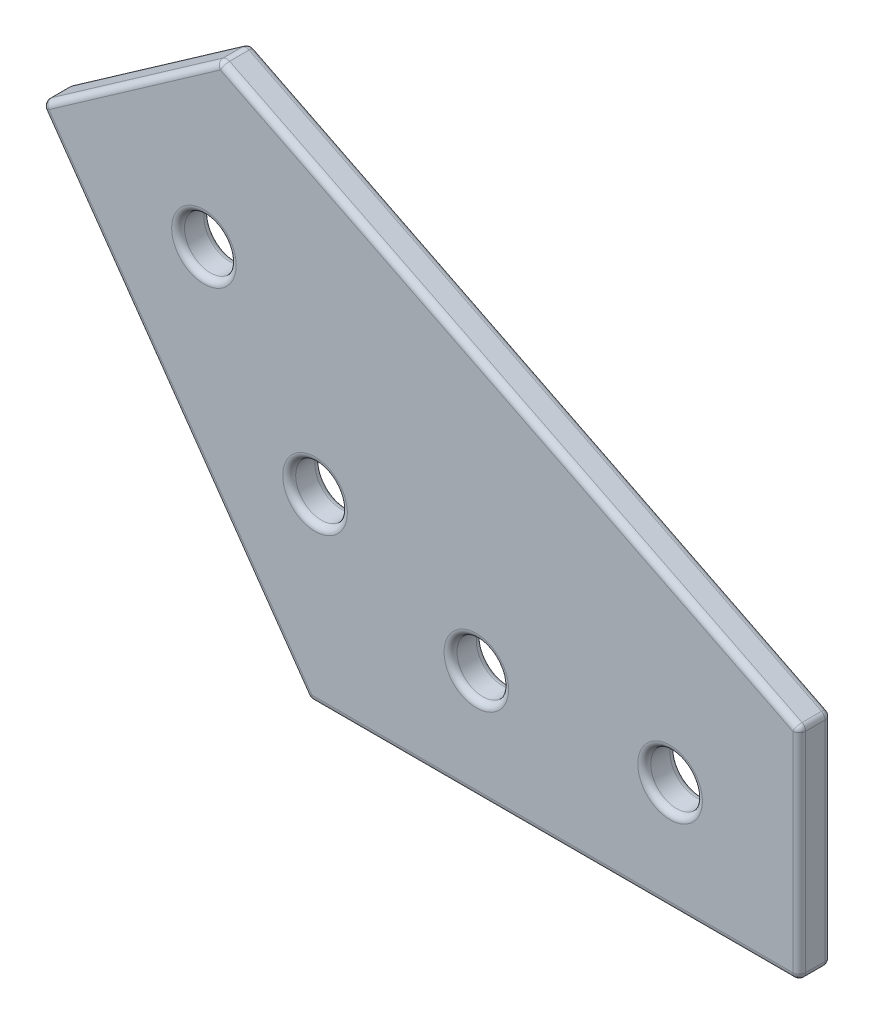
ISO-10303-21;
HEADER;
FILE_DESCRIPTION(('STEP AP214'),'2;1');
FILE_NAME('part.step','',(''),(''),'','','');
FILE_SCHEMA(('AUTOMOTIVE_DESIGN { 1 0 10303 214 1 1 1 1 }'));
ENDSEC;
DATA;
#1=APPLICATION_CONTEXT('core data for automotive mechanical design processes');
#2=APPLICATION_PROTOCOL_DEFINITION('international standard','automotive_design',2000,#1);
#3=PRODUCT_CONTEXT('',#1,'mechanical');
#4=PRODUCT('Part','Part','',(#3));
#5=PRODUCT_RELATED_PRODUCT_CATEGORY('part','',(#4));
#6=PRODUCT_DEFINITION_FORMATION('','',#4);
#7=PRODUCT_DEFINITION_CONTEXT('part definition',#1,'design');
#8=PRODUCT_DEFINITION('design','',#6,#7);
#9=PRODUCT_DEFINITION_SHAPE('','',#8);
#10=(LENGTH_UNIT() NAMED_UNIT(*) SI_UNIT(.MILLI.,.METRE.));
#11=(NAMED_UNIT(*) PLANE_ANGLE_UNIT() SI_UNIT($,.RADIAN.));
#12=(NAMED_UNIT(*) SI_UNIT($,.STERADIAN.) SOLID_ANGLE_UNIT());
#13=UNCERTAINTY_MEASURE_WITH_UNIT(LENGTH_MEASURE(1.E-05),#10,'distance_accuracy_value','');
#14=(GEOMETRIC_REPRESENTATION_CONTEXT(3) GLOBAL_UNCERTAINTY_ASSIGNED_CONTEXT((#13)) GLOBAL_UNIT_ASSIGNED_CONTEXT((#10,
#11,#12)) REPRESENTATION_CONTEXT('',''));
#15=CARTESIAN_POINT('',(0.,0.,0.));
#16=DIRECTION('',(0.,0.,1.));
#17=DIRECTION('',(1.,0.,0.));
#18=AXIS2_PLACEMENT_3D('',#15,#16,#17);
#19=CARTESIAN_POINT('',(-24.8760281440643,-35.,5.));
#20=DIRECTION('',(0.819152044288993,0.573576436351045,0.));
#21=DIRECTION('',(-0.573576436351045,0.819152044288992,0.));
#22=AXIS2_PLACEMENT_3D('',#19,#20,#21);
#23=PLANE('',#22);
#24=DIRECTION('',(0.573576436351045,-0.819152044288992,0.));
#25=VECTOR('',#24,1.);
#26=CARTESIAN_POINT('',(-24.8760281440643,-35.,1.));
#27=LINE('',#26,#25);
#28=CARTESIAN_POINT('',(-65.886743343164,23.569371166663,1.));
#29=VERTEX_POINT('',#28);
#30=CARTESIAN_POINT('',(-25.1746131378016,-34.573576436351,1.));
#31=VERTEX_POINT('',#30);
#32=EDGE_CURVE('E245',#29,#31,#27,.T.);
#33=ORIENTED_EDGE('',*,*,#32,.T.);
#34=DIRECTION('',(0.,0.,-1.));
#35=VECTOR('',#34,1.);
#36=CARTESIAN_POINT('',(-25.1746131378016,-34.573576436351,5.));
#37=LINE('',#36,#35);
#38=CARTESIAN_POINT('',(-25.1746131378016,-34.573576436351,4.));
#39=VERTEX_POINT('',#38);
#40=EDGE_CURVE('E252',#31,#39,#37,.F.);
#41=ORIENTED_EDGE('',*,*,#40,.T.);
#42=DIRECTION('',(0.573576436351045,-0.819152044288992,0.));
#43=VECTOR('',#42,1.);
#44=CARTESIAN_POINT('',(-24.8760281440643,-35.,4.));
#45=LINE('',#44,#43);
#46=CARTESIAN_POINT('',(-65.886743343164,23.569371166663,4.));
#47=VERTEX_POINT('',#46);
#48=EDGE_CURVE('E248',#39,#47,#45,.F.);
#49=ORIENTED_EDGE('',*,*,#48,.T.);
#50=DIRECTION('',(0.,0.,-1.));
#51=VECTOR('',#50,1.);
#52=CARTESIAN_POINT('',(-65.886743343164,23.569371166663,5.));
#53=LINE('',#52,#51);
#54=EDGE_CURVE('E242',#47,#29,#53,.T.);
#55=ORIENTED_EDGE('',*,*,#54,.T.);
#56=EDGE_LOOP('',(#33,#41,#49,#55));
#57=FACE_BOUND('',#56,.T.);
#58=ADVANCED_FACE('F38',(#57),#23,.F.);
#59=CARTESIAN_POINT('',(51.1239718559357,-35.,5.));
#60=DIRECTION('',(0.,1.,0.));
#61=DIRECTION('',(-1.,0.,0.));
#62=AXIS2_PLACEMENT_3D('',#59,#60,#61);
#63=PLANE('',#62);
#64=DIRECTION('',(1.,0.,0.));
#65=VECTOR('',#64,1.);
#66=CARTESIAN_POINT('',(51.1239718559357,-35.,1.));
#67=LINE('',#66,#65);
#68=CARTESIAN_POINT('',(-24.3554610935126,-35.,1.));
#69=VERTEX_POINT('',#68);
#70=CARTESIAN_POINT('',(50.1239718559357,-35.,1.));
#71=VERTEX_POINT('',#70);
#72=EDGE_CURVE('E232',#69,#71,#67,.T.);
#73=ORIENTED_EDGE('',*,*,#72,.T.);
#74=DIRECTION('',(0.,0.,-1.));
#75=VECTOR('',#74,1.);
#76=CARTESIAN_POINT('',(50.1239718559357,-35.,5.));
#77=LINE('',#76,#75);
#78=CARTESIAN_POINT('',(50.1239718559357,-35.,4.));
#79=VERTEX_POINT('',#78);
#80=EDGE_CURVE('E239',#71,#79,#77,.F.);
#81=ORIENTED_EDGE('',*,*,#80,.T.);
#82=DIRECTION('',(1.,0.,0.));
#83=VECTOR('',#82,1.);
#84=CARTESIAN_POINT('',(51.1239718559357,-35.,4.));
#85=LINE('',#84,#83);
#86=CARTESIAN_POINT('',(-24.3554610935126,-35.,4.));
#87=VERTEX_POINT('',#86);
#88=EDGE_CURVE('E235',#79,#87,#85,.F.);
#89=ORIENTED_EDGE('',*,*,#88,.T.);
#90=DIRECTION('',(0.,0.,-1.));
#91=VECTOR('',#90,1.);
#92=CARTESIAN_POINT('',(-24.3554610935126,-35.,5.));
#93=LINE('',#92,#91);
#94=EDGE_CURVE('E229',#87,#69,#93,.T.);
#95=ORIENTED_EDGE('',*,*,#94,.T.);
#96=EDGE_LOOP('',(#73,#81,#89,#95));
#97=FACE_BOUND('',#96,.T.);
#98=ADVANCED_FACE('F544',(#97),#63,.F.);
#99=CARTESIAN_POINT('',(51.1239718559356,-0.999999999999966,5.));
#100=DIRECTION('',(-1.,0.,0.));
#101=DIRECTION('',(0.,-1.,0.));
#102=AXIS2_PLACEMENT_3D('',#99,#100,#101);
#103=PLANE('',#102);
#104=DIRECTION('',(0.,1.,0.));
#105=VECTOR('',#104,1.);
#106=CARTESIAN_POINT('',(51.1239718559356,-0.999999999999966,1.));
#107=LINE('',#106,#105);
#108=CARTESIAN_POINT('',(51.1239718559357,-34.,1.));
#109=VERTEX_POINT('',#108);
#110=CARTESIAN_POINT('',(51.1239718559356,-1.61788886978823,1.));
#111=VERTEX_POINT('',#110);
#112=EDGE_CURVE('E219',#109,#111,#107,.T.);
#113=ORIENTED_EDGE('',*,*,#112,.T.);
#114=DIRECTION('',(0.,0.,-1.));
#115=VECTOR('',#114,1.);
#116=CARTESIAN_POINT('',(51.1239718559356,-1.61788886978823,5.));
#117=LINE('',#116,#115);
#118=CARTESIAN_POINT('',(51.1239718559356,-1.61788886978823,4.));
#119=VERTEX_POINT('',#118);
#120=EDGE_CURVE('E226',#111,#119,#117,.F.);
#121=ORIENTED_EDGE('',*,*,#120,.T.);
#122=DIRECTION('',(0.,1.,0.));
#123=VECTOR('',#122,1.);
#124=CARTESIAN_POINT('',(51.1239718559356,-0.999999999999966,4.));
#125=LINE('',#124,#123);
#126=CARTESIAN_POINT('',(51.1239718559357,-34.,4.));
#127=VERTEX_POINT('',#126);
#128=EDGE_CURVE('E222',#119,#127,#125,.F.);
#129=ORIENTED_EDGE('',*,*,#128,.T.);
#130=DIRECTION('',(0.,0.,-1.));
#131=VECTOR('',#130,1.);
#132=CARTESIAN_POINT('',(51.1239718559357,-34.,5.));
#133=LINE('',#132,#131);
#134=EDGE_CURVE('E216',#127,#109,#133,.T.);
#135=ORIENTED_EDGE('',*,*,#134,.T.);
#136=EDGE_LOOP('',(#113,#121,#129,#135));
#137=FACE_BOUND('',#136,.T.);
#138=ADVANCED_FACE('F488',(#137),#103,.F.);
#139=CARTESIAN_POINT('',(-38.6091502736893,43.8901220468875,5.));
#140=DIRECTION('',(-0.447401443755537,-0.894333242212019,0.));
#141=DIRECTION('',(0.894333242212019,-0.447401443755537,0.));
#142=AXIS2_PLACEMENT_3D('',#139,#140,#141);
#143=PLANE('',#142);
#144=DIRECTION('',(-0.894333242212019,0.447401443755537,0.));
#145=VECTOR('',#144,1.);
#146=CARTESIAN_POINT('',(-38.6091502736893,43.8901220468875,1.));
#147=LINE('',#146,#145);
#148=CARTESIAN_POINT('',(50.5713732996912,-0.723555627576211,1.));
#149=VERTEX_POINT('',#148);
#150=CARTESIAN_POINT('',(-38.0762630263135,43.6235385044429,1.));
#151=VERTEX_POINT('',#150);
#152=EDGE_CURVE('E206',#149,#151,#147,.T.);
#153=ORIENTED_EDGE('',*,*,#152,.T.);
#154=DIRECTION('',(0.,0.,-1.));
#155=VECTOR('',#154,1.);
#156=CARTESIAN_POINT('',(-38.0762630263135,43.6235385044429,5.));
#157=LINE('',#156,#155);
#158=CARTESIAN_POINT('',(-38.0762630263135,43.6235385044429,4.));
#159=VERTEX_POINT('',#158);
#160=EDGE_CURVE('E213',#151,#159,#157,.F.);
#161=ORIENTED_EDGE('',*,*,#160,.T.);
#162=DIRECTION('',(-0.894333242212019,0.447401443755537,0.));
#163=VECTOR('',#162,1.);
#164=CARTESIAN_POINT('',(-38.6091502736893,43.8901220468875,4.));
#165=LINE('',#164,#163);
#166=CARTESIAN_POINT('',(50.5713732996912,-0.723555627576211,4.));
#167=VERTEX_POINT('',#166);
#168=EDGE_CURVE('E209',#159,#167,#165,.F.);
#169=ORIENTED_EDGE('',*,*,#168,.T.);
#170=DIRECTION('',(0.,0.,-1.));
#171=VECTOR('',#170,1.);
#172=CARTESIAN_POINT('',(50.5713732996912,-0.723555627576214,5.));
#173=LINE('',#172,#171);
#174=EDGE_CURVE('E203',#167,#149,#173,.T.);
#175=ORIENTED_EDGE('',*,*,#174,.T.);
#176=EDGE_LOOP('',(#153,#161,#169,#175));
#177=FACE_BOUND('',#176,.T.);
#178=ADVANCED_FACE('F496',(#177),#143,.F.);
#179=CARTESIAN_POINT('',(-66.4603197795151,24.3885232109519,5.));
#180=DIRECTION('',(0.573576436351045,-0.819152044288992,0.));
#181=DIRECTION('',(0.819152044288993,0.573576436351045,0.));
#182=AXIS2_PLACEMENT_3D('',#179,#180,#181);
#183=PLANE('',#182);
#184=DIRECTION('',(-0.819152044288993,-0.573576436351045,0.));
#185=VECTOR('',#184,1.);
#186=CARTESIAN_POINT('',(-66.4603197795151,24.3885232109519,4.));
#187=LINE('',#186,#185);
#188=CARTESIAN_POINT('',(-65.6411677352261,24.962099647303,4.));
#189=VERTEX_POINT('',#188);
#190=CARTESIAN_POINT('',(-39.09724090642,43.5483573065199,4.));
#191=VERTEX_POINT('',#190);
#192=EDGE_CURVE('E152',#189,#191,#187,.F.);
#193=ORIENTED_EDGE('',*,*,#192,.T.);
#194=DIRECTION('',(0.,0.,-1.));
#195=VECTOR('',#194,1.);
#196=CARTESIAN_POINT('',(-39.09724090642,43.5483573065199,5.));
#197=LINE('',#196,#195);
#198=CARTESIAN_POINT('',(-39.09724090642,43.5483573065199,1.));
#199=VERTEX_POINT('',#198);
#200=EDGE_CURVE('E200',#191,#199,#197,.T.);
#201=ORIENTED_EDGE('',*,*,#200,.T.);
#202=DIRECTION('',(-0.819152044288993,-0.573576436351045,0.));
#203=VECTOR('',#202,1.);
#204=CARTESIAN_POINT('',(-66.4603197795151,24.3885232109519,1.));
#205=LINE('',#204,#203);
#206=CARTESIAN_POINT('',(-65.6411677352261,24.962099647303,1.));
#207=VERTEX_POINT('',#206);
#208=EDGE_CURVE('E190',#199,#207,#205,.T.);
#209=ORIENTED_EDGE('',*,*,#208,.T.);
#210=DIRECTION('',(0.,0.,-1.));
#211=VECTOR('',#210,1.);
#212=CARTESIAN_POINT('',(-65.6411677352261,24.962099647303,5.));
#213=LINE('',#212,#211);
#214=EDGE_CURVE('E186',#207,#189,#213,.F.);
#215=ORIENTED_EDGE('',*,*,#214,.T.);
#216=EDGE_LOOP('',(#193,#201,#209,#215));
#217=FACE_BOUND('',#216,.T.);
#218=ADVANCED_FACE('F462',(#217),#183,.F.);
#219=CARTESIAN_POINT('',(0.,0.,5.));
#220=DIRECTION('',(0.,0.,-1.));
#221=DIRECTION('',(-1.,0.,0.));
#222=AXIS2_PLACEMENT_3D('',#219,#220,#221);
#223=PLANE('',#222);
#224=DIRECTION('',(-0.894333242212019,0.447401443755537,0.));
#225=VECTOR('',#224,1.);
#226=CARTESIAN_POINT('',(9.38585842297163,18.7618643424535,5.));
#227=LINE('',#226,#225);
#228=CARTESIAN_POINT('',(50.1239718559356,-1.61788886978823,5.));
#229=VERTEX_POINT('',#228);
#230=CARTESIAN_POINT('',(-38.523664470069,42.7292052622309,5.));
#231=VERTEX_POINT('',#230);
#232=EDGE_CURVE('E183',#229,#231,#227,.T.);
#233=ORIENTED_EDGE('',*,*,#232,.T.);
#234=DIRECTION('',(-0.819152044288993,-0.573576436351045,0.));
#235=VECTOR('',#234,1.);
#236=CARTESIAN_POINT('',(-32.7500570517753,46.7719286991836,5.));
#237=LINE('',#236,#235);
#238=CARTESIAN_POINT('',(-65.067591298875,24.142947603014,5.));
#239=VERTEX_POINT('',#238);
#240=EDGE_CURVE('E150',#231,#239,#237,.T.);
#241=ORIENTED_EDGE('',*,*,#240,.T.);
#242=DIRECTION('',(0.573576436351045,-0.819152044288992,0.));
#243=VECTOR('',#242,1.);
#244=CARTESIAN_POINT('',(-32.3175342470997,-22.6289810961696,5.));
#245=LINE('',#244,#243);
#246=CARTESIAN_POINT('',(-24.3554610935126,-34.,5.));
#247=VERTEX_POINT('',#246);
#248=EDGE_CURVE('E170',#239,#247,#245,.T.);
#249=ORIENTED_EDGE('',*,*,#248,.T.);
#250=DIRECTION('',(1.,0.,0.));
#251=VECTOR('',#250,1.);
#252=CARTESIAN_POINT('',(0.,-34.,5.));
#253=LINE('',#252,#251);
#254=CARTESIAN_POINT('',(50.1239718559357,-34.,5.));
#255=VERTEX_POINT('',#254);
#256=EDGE_CURVE('E177',#247,#255,#253,.T.);
#257=ORIENTED_EDGE('',*,*,#256,.T.);
#258=DIRECTION('',(0.,1.,0.));
#259=VECTOR('',#258,1.);
#260=CARTESIAN_POINT('',(50.1239718559356,0.,5.));
#261=LINE('',#260,#259);
#262=EDGE_CURVE('E192',#255,#229,#261,.T.);
#263=ORIENTED_EDGE('',*,*,#262,.T.);
#264=EDGE_LOOP('',(#233,#241,#249,#257,#263));
#265=FACE_BOUND('',#264,.T.);
#266=CARTESIAN_POINT('',(31.1239718559356,-18.,5.));
#267=DIRECTION('',(0.,0.,-1.));
#268=DIRECTION('',(-1.,0.,0.));
#269=AXIS2_PLACEMENT_3D('',#266,#267,#268);
#270=CIRCLE('',#269,5.00000000000001);
#271=CARTESIAN_POINT('',(26.1239718559356,-18.,5.));
#272=VERTEX_POINT('',#271);
#273=EDGE_CURVE('E178',#272,#272,#270,.T.);
#274=ORIENTED_EDGE('',*,*,#273,.T.);
#275=EDGE_LOOP('',(#274));
#276=FACE_BOUND('',#275,.T.);
#277=CARTESIAN_POINT('',(1.12397185593564,-18.0000000000002,5.));
#278=DIRECTION('',(0.,0.,-1.));
#279=DIRECTION('',(-1.,0.,0.));
#280=AXIS2_PLACEMENT_3D('',#277,#278,#279);
#281=CIRCLE('',#280,5.00000000000001);
#282=CARTESIAN_POINT('',(-3.87602814406436,-18.0000000000002,5.));
#283=VERTEX_POINT('',#282);
#284=EDGE_CURVE('E427',#283,#283,#281,.T.);
#285=ORIENTED_EDGE('',*,*,#284,.T.);
#286=EDGE_LOOP('',(#285));
#287=FACE_BOUND('',#286,.T.);
#288=CARTESIAN_POINT('',(-23.8559132090496,-6.81827958552968,5.));
#289=DIRECTION('',(0.,0.,-1.));
#290=DIRECTION('',(-1.,0.,0.));
#291=AXIS2_PLACEMENT_3D('',#288,#289,#290);
#292=CIRCLE('',#291,5.);
#293=CARTESIAN_POINT('',(-28.8559132090496,-6.81827958552968,5.));
#294=VERTEX_POINT('',#293);
#295=EDGE_CURVE('E421',#294,#294,#292,.T.);
#296=ORIENTED_EDGE('',*,*,#295,.T.);
#297=EDGE_LOOP('',(#296));
#298=FACE_BOUND('',#297,.T.);
#299=CARTESIAN_POINT('',(-41.0632062995813,17.7562817431399,5.));
#300=DIRECTION('',(0.,0.,-1.));
#301=DIRECTION('',(-1.,0.,0.));
#302=AXIS2_PLACEMENT_3D('',#299,#300,#301);
#303=CIRCLE('',#302,5.00000000000001);
#304=CARTESIAN_POINT('',(-46.0632062995813,17.7562817431399,5.));
#305=VERTEX_POINT('',#304);
#306=EDGE_CURVE('E415',#305,#305,#303,.T.);
#307=ORIENTED_EDGE('',*,*,#306,.T.);
#308=EDGE_LOOP('',(#307));
#309=FACE_BOUND('',#308,.T.);
#310=ADVANCED_FACE('F180',(#265,#276,#287,#298,#309),#223,.F.);
#311=CARTESIAN_POINT('',(0.,0.,0.));
#312=DIRECTION('',(0.,0.,-1.));
#313=DIRECTION('',(-1.,0.,0.));
#314=AXIS2_PLACEMENT_3D('',#311,#312,#313);
#315=PLANE('',#314);
#316=DIRECTION('',(0.,1.,0.));
#317=VECTOR('',#316,1.);
#318=CARTESIAN_POINT('',(50.1239718559357,-35.,0.));
#319=LINE('',#318,#317);
#320=CARTESIAN_POINT('',(50.1239718559356,-1.61788886978823,0.));
#321=VERTEX_POINT('',#320);
#322=CARTESIAN_POINT('',(50.1239718559357,-34.,0.));
#323=VERTEX_POINT('',#322);
#324=EDGE_CURVE('E48',#321,#323,#319,.F.);
#325=ORIENTED_EDGE('',*,*,#324,.T.);
#326=DIRECTION('',(1.,0.,0.));
#327=VECTOR('',#326,1.);
#328=CARTESIAN_POINT('',(-24.8760281440643,-34.,0.));
#329=LINE('',#328,#327);
#330=CARTESIAN_POINT('',(-24.3554610935126,-34.,0.));
#331=VERTEX_POINT('',#330);
#332=EDGE_CURVE('E11',#323,#331,#329,.F.);
#333=ORIENTED_EDGE('',*,*,#332,.T.);
#334=DIRECTION('',(0.573576436351045,-0.819152044288992,0.));
#335=VECTOR('',#334,1.);
#336=CARTESIAN_POINT('',(-65.6411677352261,24.962099647303,0.));
#337=LINE('',#336,#335);
#338=CARTESIAN_POINT('',(-65.067591298875,24.142947603014,0.));
#339=VERTEX_POINT('',#338);
#340=EDGE_CURVE('E303',#331,#339,#337,.F.);
#341=ORIENTED_EDGE('',*,*,#340,.T.);
#342=DIRECTION('',(-0.819152044288993,-0.573576436351045,0.));
#343=VECTOR('',#342,1.);
#344=CARTESIAN_POINT('',(-38.0355738373382,43.0709700025985,0.));
#345=LINE('',#344,#343);
#346=CARTESIAN_POINT('',(-38.523664470069,42.7292052622309,0.));
#347=VERTEX_POINT('',#346);
#348=EDGE_CURVE('E306',#339,#347,#345,.F.);
#349=ORIENTED_EDGE('',*,*,#348,.T.);
#350=DIRECTION('',(-0.894333242212019,0.447401443755537,0.));
#351=VECTOR('',#350,1.);
#352=CARTESIAN_POINT('',(50.6765704121801,-1.89433324221198,0.));
#353=LINE('',#352,#351);
#354=EDGE_CURVE('E59',#347,#321,#353,.F.);
#355=ORIENTED_EDGE('',*,*,#354,.T.);
#356=EDGE_LOOP('',(#325,#333,#341,#349,#355));
#357=FACE_BOUND('',#356,.T.);
#358=CARTESIAN_POINT('',(-41.0632062995813,17.7562817431399,0.));
#359=DIRECTION('',(0.,0.,-1.));
#360=DIRECTION('',(-1.,0.,0.));
#361=AXIS2_PLACEMENT_3D('',#358,#359,#360);
#362=CIRCLE('',#361,5.00000000000001);
#363=CARTESIAN_POINT('',(-46.0632062995813,17.7562817431399,0.));
#364=VERTEX_POINT('',#363);
#365=EDGE_CURVE('E299',#364,#364,#362,.F.);
#366=ORIENTED_EDGE('',*,*,#365,.T.);
#367=EDGE_LOOP('',(#366));
#368=FACE_BOUND('',#367,.T.);
#369=CARTESIAN_POINT('',(-23.8559132090496,-6.81827958552968,0.));
#370=DIRECTION('',(0.,0.,-1.));
#371=DIRECTION('',(-1.,0.,0.));
#372=AXIS2_PLACEMENT_3D('',#369,#370,#371);
#373=CIRCLE('',#372,5.);
#374=CARTESIAN_POINT('',(-28.8559132090496,-6.81827958552968,0.));
#375=VERTEX_POINT('',#374);
#376=EDGE_CURVE('E295',#375,#375,#373,.F.);
#377=ORIENTED_EDGE('',*,*,#376,.T.);
#378=EDGE_LOOP('',(#377));
#379=FACE_BOUND('',#378,.T.);
#380=CARTESIAN_POINT('',(1.12397185593564,-18.0000000000002,0.));
#381=DIRECTION('',(0.,0.,-1.));
#382=DIRECTION('',(-1.,0.,0.));
#383=AXIS2_PLACEMENT_3D('',#380,#381,#382);
#384=CIRCLE('',#383,5.00000000000001);
#385=CARTESIAN_POINT('',(-3.87602814406436,-18.0000000000002,0.));
#386=VERTEX_POINT('',#385);
#387=EDGE_CURVE('E291',#386,#386,#384,.F.);
#388=ORIENTED_EDGE('',*,*,#387,.T.);
#389=EDGE_LOOP('',(#388));
#390=FACE_BOUND('',#389,.T.);
#391=CARTESIAN_POINT('',(31.1239718559356,-18.,0.));
#392=DIRECTION('',(0.,0.,-1.));
#393=DIRECTION('',(-1.,0.,0.));
#394=AXIS2_PLACEMENT_3D('',#391,#392,#393);
#395=CIRCLE('',#394,5.00000000000001);
#396=CARTESIAN_POINT('',(26.1239718559356,-18.,0.));
#397=VERTEX_POINT('',#396);
#398=EDGE_CURVE('E287',#397,#397,#395,.F.);
#399=ORIENTED_EDGE('',*,*,#398,.T.);
#400=EDGE_LOOP('',(#399));
#401=FACE_BOUND('',#400,.T.);
#402=ADVANCED_FACE('F521',(#357,#368,#379,#390,#401),#315,.T.);
#403=CARTESIAN_POINT('',(-41.0632062995813,17.7562817431399,0.));
#404=DIRECTION('',(0.,0.,1.));
#405=DIRECTION('',(1.,0.,0.));
#406=AXIS2_PLACEMENT_3D('',#403,#404,#405);
#407=CYLINDRICAL_SURFACE('',#406,4.00000000000001);
#408=CARTESIAN_POINT('',(-41.0632062995813,17.7562817431399,4.));
#409=DIRECTION('',(0.,0.,-1.));
#410=DIRECTION('',(-1.,0.,0.));
#411=AXIS2_PLACEMENT_3D('',#408,#409,#410);
#412=CIRCLE('',#411,4.00000000000001);
#413=CARTESIAN_POINT('',(-45.0632062995813,17.7562817431399,4.));
#414=VERTEX_POINT('',#413);
#415=EDGE_CURVE('E283',#414,#414,#412,.F.);
#416=ORIENTED_EDGE('',*,*,#415,.T.);
#417=EDGE_LOOP('',(#416));
#418=FACE_BOUND('',#417,.T.);
#419=CARTESIAN_POINT('',(-41.0632062995813,17.7562817431399,1.));
#420=DIRECTION('',(0.,0.,-1.));
#421=DIRECTION('',(-1.,0.,0.));
#422=AXIS2_PLACEMENT_3D('',#419,#420,#421);
#423=CIRCLE('',#422,4.00000000000001);
#424=CARTESIAN_POINT('',(-45.0632062995813,17.7562817431399,1.));
#425=VERTEX_POINT('',#424);
#426=EDGE_CURVE('E279',#425,#425,#423,.T.);
#427=ORIENTED_EDGE('',*,*,#426,.T.);
#428=EDGE_LOOP('',(#427));
#429=FACE_BOUND('',#428,.T.);
#430=ADVANCED_FACE('F524',(#418,#429),#407,.F.);
#431=CARTESIAN_POINT('',(-23.8559132090496,-6.81827958552968,0.));
#432=DIRECTION('',(0.,0.,1.));
#433=DIRECTION('',(1.,0.,0.));
#434=AXIS2_PLACEMENT_3D('',#431,#432,#433);
#435=CYLINDRICAL_SURFACE('',#434,4.);
#436=CARTESIAN_POINT('',(-23.8559132090496,-6.81827958552968,4.));
#437=DIRECTION('',(0.,0.,-1.));
#438=DIRECTION('',(-1.,0.,0.));
#439=AXIS2_PLACEMENT_3D('',#436,#437,#438);
#440=CIRCLE('',#439,4.);
#441=CARTESIAN_POINT('',(-27.8559132090496,-6.81827958552968,4.));
#442=VERTEX_POINT('',#441);
#443=EDGE_CURVE('E275',#442,#442,#440,.F.);
#444=ORIENTED_EDGE('',*,*,#443,.T.);
#445=EDGE_LOOP('',(#444));
#446=FACE_BOUND('',#445,.T.);
#447=CARTESIAN_POINT('',(-23.8559132090496,-6.81827958552968,1.));
#448=DIRECTION('',(0.,0.,-1.));
#449=DIRECTION('',(-1.,0.,0.));
#450=AXIS2_PLACEMENT_3D('',#447,#448,#449);
#451=CIRCLE('',#450,4.);
#452=CARTESIAN_POINT('',(-27.8559132090496,-6.81827958552968,1.));
#453=VERTEX_POINT('',#452);
#454=EDGE_CURVE('E271',#453,#453,#451,.T.);
#455=ORIENTED_EDGE('',*,*,#454,.T.);
#456=EDGE_LOOP('',(#455));
#457=FACE_BOUND('',#456,.T.);
#458=ADVANCED_FACE('F636',(#446,#457),#435,.F.);
#459=CARTESIAN_POINT('',(1.12397185593564,-18.0000000000002,0.));
#460=DIRECTION('',(0.,0.,1.));
#461=DIRECTION('',(1.,0.,0.));
#462=AXIS2_PLACEMENT_3D('',#459,#460,#461);
#463=CYLINDRICAL_SURFACE('',#462,4.00000000000001);
#464=CARTESIAN_POINT('',(1.12397185593564,-18.0000000000002,4.));
#465=DIRECTION('',(0.,0.,-1.));
#466=DIRECTION('',(-1.,0.,0.));
#467=AXIS2_PLACEMENT_3D('',#464,#465,#466);
#468=CIRCLE('',#467,4.00000000000001);
#469=CARTESIAN_POINT('',(-2.87602814406436,-18.0000000000002,4.));
#470=VERTEX_POINT('',#469);
#471=EDGE_CURVE('E267',#470,#470,#468,.F.);
#472=ORIENTED_EDGE('',*,*,#471,.T.);
#473=EDGE_LOOP('',(#472));
#474=FACE_BOUND('',#473,.T.);
#475=CARTESIAN_POINT('',(1.12397185593564,-18.0000000000002,1.));
#476=DIRECTION('',(0.,0.,-1.));
#477=DIRECTION('',(-1.,0.,0.));
#478=AXIS2_PLACEMENT_3D('',#475,#476,#477);
#479=CIRCLE('',#478,4.00000000000001);
#480=CARTESIAN_POINT('',(-2.87602814406436,-18.0000000000002,1.));
#481=VERTEX_POINT('',#480);
#482=EDGE_CURVE('E263',#481,#481,#479,.T.);
#483=ORIENTED_EDGE('',*,*,#482,.T.);
#484=EDGE_LOOP('',(#483));
#485=FACE_BOUND('',#484,.T.);
#486=ADVANCED_FACE('F638',(#474,#485),#463,.F.);
#487=CARTESIAN_POINT('',(31.1239718559356,-18.,0.));
#488=DIRECTION('',(0.,0.,1.));
#489=DIRECTION('',(1.,0.,0.));
#490=AXIS2_PLACEMENT_3D('',#487,#488,#489);
#491=CYLINDRICAL_SURFACE('',#490,4.00000000000001);
#492=CARTESIAN_POINT('',(31.1239718559356,-18.,4.));
#493=DIRECTION('',(0.,0.,-1.));
#494=DIRECTION('',(-1.,0.,0.));
#495=AXIS2_PLACEMENT_3D('',#492,#493,#494);
#496=CIRCLE('',#495,4.00000000000001);
#497=CARTESIAN_POINT('',(27.1239718559356,-18.,4.));
#498=VERTEX_POINT('',#497);
#499=EDGE_CURVE('E259',#498,#498,#496,.F.);
#500=ORIENTED_EDGE('',*,*,#499,.T.);
#501=EDGE_LOOP('',(#500));
#502=FACE_BOUND('',#501,.T.);
#503=CARTESIAN_POINT('',(31.1239718559356,-18.,1.));
#504=DIRECTION('',(0.,0.,-1.));
#505=DIRECTION('',(-1.,0.,0.));
#506=AXIS2_PLACEMENT_3D('',#503,#504,#505);
#507=CIRCLE('',#506,4.00000000000001);
#508=CARTESIAN_POINT('',(27.1239718559356,-18.,1.));
#509=VERTEX_POINT('',#508);
#510=EDGE_CURVE('E255',#509,#509,#507,.T.);
#511=ORIENTED_EDGE('',*,*,#510,.T.);
#512=EDGE_LOOP('',(#511));
#513=FACE_BOUND('',#512,.T.);
#514=ADVANCED_FACE('F608',(#502,#513),#491,.F.);
#515=CARTESIAN_POINT('',(50.1239718559357,-34.,1.));
#516=DIRECTION('',(0.,0.,1.));
#517=DIRECTION('',(1.,0.,0.));
#518=AXIS2_PLACEMENT_3D('',#515,#516,#517);
#519=SPHERICAL_SURFACE('',#518,1.);
#520=CARTESIAN_POINT('',(50.1239718559357,-34.,1.));
#521=DIRECTION('',(1.,0.,0.));
#522=DIRECTION('',(0.,0.,-1.));
#523=AXIS2_PLACEMENT_3D('',#520,#521,#522);
#524=CIRCLE('',#523,1.);
#525=EDGE_CURVE('E403',#323,#71,#524,.F.);
#526=ORIENTED_EDGE('',*,*,#525,.F.);
#527=CARTESIAN_POINT('',(50.1239718559357,-34.,1.));
#528=DIRECTION('',(0.,-1.,0.));
#529=DIRECTION('',(0.,0.,-1.));
#530=AXIS2_PLACEMENT_3D('',#527,#528,#529);
#531=CIRCLE('',#530,1.);
#532=EDGE_CURVE('E42',#109,#323,#531,.F.);
#533=ORIENTED_EDGE('',*,*,#532,.F.);
#534=CARTESIAN_POINT('',(50.1239718559357,-34.,1.));
#535=DIRECTION('',(0.,0.,-1.));
#536=DIRECTION('',(-1.,0.,0.));
#537=AXIS2_PLACEMENT_3D('',#534,#535,#536);
#538=CIRCLE('',#537,1.);
#539=EDGE_CURVE('E406',#71,#109,#538,.F.);
#540=ORIENTED_EDGE('',*,*,#539,.F.);
#541=EDGE_LOOP('',(#526,#533,#540));
#542=FACE_BOUND('',#541,.T.);
#543=ADVANCED_FACE('F605',(#542),#519,.T.);
#544=CARTESIAN_POINT('',(50.1239718559356,-0.999999999999966,1.));
#545=DIRECTION('',(0.,-1.,0.));
#546=DIRECTION('',(1.,0.,0.));
#547=AXIS2_PLACEMENT_3D('',#544,#545,#546);
#548=CYLINDRICAL_SURFACE('',#547,1.);
#549=ORIENTED_EDGE('',*,*,#532,.T.);
#550=ORIENTED_EDGE('',*,*,#324,.F.);
#551=CARTESIAN_POINT('',(50.1239718559356,-1.61788886978823,1.));
#552=DIRECTION('',(0.,1.,0.));
#553=DIRECTION('',(0.,0.,1.));
#554=AXIS2_PLACEMENT_3D('',#551,#552,#553);
#555=CIRCLE('',#554,1.);
#556=EDGE_CURVE('E399',#111,#321,#555,.T.);
#557=ORIENTED_EDGE('',*,*,#556,.F.);
#558=ORIENTED_EDGE('',*,*,#112,.F.);
#559=EDGE_LOOP('',(#549,#550,#557,#558));
#560=FACE_BOUND('',#559,.T.);
#561=ADVANCED_FACE('F602',(#560),#548,.T.);
#562=CARTESIAN_POINT('',(50.1239718559357,-34.,5.));
#563=DIRECTION('',(0.,0.,-1.));
#564=DIRECTION('',(-1.,0.,0.));
#565=AXIS2_PLACEMENT_3D('',#562,#563,#564);
#566=CYLINDRICAL_SURFACE('',#565,1.);
#567=ORIENTED_EDGE('',*,*,#539,.T.);
#568=ORIENTED_EDGE('',*,*,#134,.F.);
#569=CARTESIAN_POINT('',(50.1239718559357,-34.,4.));
#570=DIRECTION('',(0.,0.,1.));
#571=DIRECTION('',(1.,0.,0.));
#572=AXIS2_PLACEMENT_3D('',#569,#570,#571);
#573=CIRCLE('',#572,1.);
#574=EDGE_CURVE('E395',#79,#127,#573,.T.);
#575=ORIENTED_EDGE('',*,*,#574,.F.);
#576=ORIENTED_EDGE('',*,*,#80,.F.);
#577=EDGE_LOOP('',(#567,#568,#575,#576));
#578=FACE_BOUND('',#577,.T.);
#579=ADVANCED_FACE('F486',(#578),#566,.T.);
#580=CARTESIAN_POINT('',(51.1239718559357,-34.,1.));
#581=DIRECTION('',(-1.,0.,0.));
#582=DIRECTION('',(0.,-1.,0.));
#583=AXIS2_PLACEMENT_3D('',#580,#581,#582);
#584=CYLINDRICAL_SURFACE('',#583,1.);
#585=ORIENTED_EDGE('',*,*,#525,.T.);
#586=ORIENTED_EDGE('',*,*,#72,.F.);
#587=CARTESIAN_POINT('',(-24.3554610935126,-34.,1.));
#588=DIRECTION('',(-1.,0.,0.));
#589=DIRECTION('',(0.,-1.,0.));
#590=AXIS2_PLACEMENT_3D('',#587,#588,#589);
#591=CIRCLE('',#590,1.);
#592=EDGE_CURVE('E391',#331,#69,#591,.T.);
#593=ORIENTED_EDGE('',*,*,#592,.F.);
#594=ORIENTED_EDGE('',*,*,#332,.F.);
#595=EDGE_LOOP('',(#585,#586,#593,#594));
#596=FACE_BOUND('',#595,.T.);
#597=ADVANCED_FACE('F520',(#596),#584,.T.);
#598=CARTESIAN_POINT('',(50.1239718559356,-1.61788886978823,1.));
#599=DIRECTION('',(0.,0.,1.));
#600=DIRECTION('',(1.,0.,0.));
#601=AXIS2_PLACEMENT_3D('',#598,#599,#600);
#602=SPHERICAL_SURFACE('',#601,1.);
#603=CARTESIAN_POINT('',(50.1239718559357,-1.61788886978823,1.));
#604=DIRECTION('',(0.,0.,-1.));
#605=DIRECTION('',(-1.,0.,0.));
#606=AXIS2_PLACEMENT_3D('',#603,#604,#605);
#607=CIRCLE('',#606,1.);
#608=EDGE_CURVE('E383',#111,#149,#607,.F.);
#609=ORIENTED_EDGE('',*,*,#608,.F.);
#610=ORIENTED_EDGE('',*,*,#556,.T.);
#611=CARTESIAN_POINT('',(50.1239718559356,-1.61788886978823,1.));
#612=DIRECTION('',(0.894333242212015,-0.447401443755545,0.));
#613=DIRECTION('',(0.447401443755545,0.894333242212015,0.));
#614=AXIS2_PLACEMENT_3D('',#611,#612,#613);
#615=CIRCLE('',#614,1.);
#616=EDGE_CURVE('E387',#149,#321,#615,.F.);
#617=ORIENTED_EDGE('',*,*,#616,.F.);
#618=EDGE_LOOP('',(#609,#610,#617));
#619=FACE_BOUND('',#618,.T.);
#620=ADVANCED_FACE('F594',(#619),#602,.T.);
#621=CARTESIAN_POINT('',(50.1239718559357,-34.,4.));
#622=DIRECTION('',(0.,0.,1.));
#623=DIRECTION('',(1.,0.,0.));
#624=AXIS2_PLACEMENT_3D('',#621,#622,#623);
#625=SPHERICAL_SURFACE('',#624,1.);
#626=CARTESIAN_POINT('',(50.1239718559357,-34.,4.));
#627=DIRECTION('',(1.,0.,0.));
#628=DIRECTION('',(0.,0.,-1.));
#629=AXIS2_PLACEMENT_3D('',#626,#627,#628);
#630=CIRCLE('',#629,1.);
#631=EDGE_CURVE('E376',#79,#255,#630,.F.);
#632=ORIENTED_EDGE('',*,*,#631,.F.);
#633=ORIENTED_EDGE('',*,*,#574,.T.);
#634=CARTESIAN_POINT('',(50.1239718559357,-34.,4.));
#635=DIRECTION('',(0.,-1.,0.));
#636=DIRECTION('',(0.,0.,-1.));
#637=AXIS2_PLACEMENT_3D('',#634,#635,#636);
#638=CIRCLE('',#637,1.);
#639=EDGE_CURVE('E380',#255,#127,#638,.F.);
#640=ORIENTED_EDGE('',*,*,#639,.F.);
#641=EDGE_LOOP('',(#632,#633,#640));
#642=FACE_BOUND('',#641,.T.);
#643=ADVANCED_FACE('F484',(#642),#625,.T.);
#644=CARTESIAN_POINT('',(-24.3554610935126,-34.,1.));
#645=DIRECTION('',(0.,0.,1.));
#646=DIRECTION('',(1.,0.,0.));
#647=AXIS2_PLACEMENT_3D('',#644,#645,#646);
#648=SPHERICAL_SURFACE('',#647,1.);
#649=CARTESIAN_POINT('',(-24.3554610935126,-34.,1.));
#650=DIRECTION('',(0.573576436351045,-0.819152044288993,0.));
#651=DIRECTION('',(0.819152044288993,0.573576436351045,0.));
#652=AXIS2_PLACEMENT_3D('',#649,#650,#651);
#653=CIRCLE('',#652,1.);
#654=EDGE_CURVE('E368',#331,#31,#653,.F.);
#655=ORIENTED_EDGE('',*,*,#654,.F.);
#656=ORIENTED_EDGE('',*,*,#592,.T.);
#657=CARTESIAN_POINT('',(-24.3554610935126,-34.,1.));
#658=DIRECTION('',(0.,0.,-1.));
#659=DIRECTION('',(-1.,0.,0.));
#660=AXIS2_PLACEMENT_3D('',#657,#658,#659);
#661=CIRCLE('',#660,1.);
#662=EDGE_CURVE('E372',#31,#69,#661,.F.);
#663=ORIENTED_EDGE('',*,*,#662,.F.);
#664=EDGE_LOOP('',(#655,#656,#663));
#665=FACE_BOUND('',#664,.T.);
#666=ADVANCED_FACE('F516',(#665),#648,.T.);
#667=CARTESIAN_POINT('',(-39.0565517174448,42.9957888046755,1.));
#668=DIRECTION('',(0.894333242212019,-0.447401443755537,0.));
#669=DIRECTION('',(0.447401443755537,0.894333242212019,0.));
#670=AXIS2_PLACEMENT_3D('',#667,#668,#669);
#671=CYLINDRICAL_SURFACE('',#670,1.);
#672=ORIENTED_EDGE('',*,*,#616,.T.);
#673=ORIENTED_EDGE('',*,*,#354,.F.);
#674=CARTESIAN_POINT('',(-38.523664470069,42.7292052622309,1.));
#675=DIRECTION('',(-0.894333242212018,0.447401443755539,0.));
#676=DIRECTION('',(-0.447401443755539,-0.894333242212018,0.));
#677=AXIS2_PLACEMENT_3D('',#674,#675,#676);
#678=CIRCLE('',#677,1.);
#679=EDGE_CURVE('E360',#151,#347,#678,.T.);
#680=ORIENTED_EDGE('',*,*,#679,.F.);
#681=ORIENTED_EDGE('',*,*,#152,.F.);
#682=EDGE_LOOP('',(#672,#673,#680,#681));
#683=FACE_BOUND('',#682,.T.);
#684=ADVANCED_FACE('F500',(#683),#671,.T.);
#685=CARTESIAN_POINT('',(50.1239718559357,-1.61788886978823,5.));
#686=DIRECTION('',(0.,0.,-1.));
#687=DIRECTION('',(-1.,0.,0.));
#688=AXIS2_PLACEMENT_3D('',#685,#686,#687);
#689=CYLINDRICAL_SURFACE('',#688,1.);
#690=ORIENTED_EDGE('',*,*,#608,.T.);
#691=ORIENTED_EDGE('',*,*,#174,.F.);
#692=CARTESIAN_POINT('',(50.1239718559356,-1.61788886978823,4.));
#693=DIRECTION('',(0.,0.,1.));
#694=DIRECTION('',(1.,0.,0.));
#695=AXIS2_PLACEMENT_3D('',#692,#693,#694);
#696=CIRCLE('',#695,1.);
#697=EDGE_CURVE('E356',#119,#167,#696,.T.);
#698=ORIENTED_EDGE('',*,*,#697,.F.);
#699=ORIENTED_EDGE('',*,*,#120,.F.);
#700=EDGE_LOOP('',(#690,#691,#698,#699));
#701=FACE_BOUND('',#700,.T.);
#702=ADVANCED_FACE('F492',(#701),#689,.T.);
#703=CARTESIAN_POINT('',(50.1239718559356,0.,4.));
#704=DIRECTION('',(0.,1.,0.));
#705=DIRECTION('',(-1.,0.,0.));
#706=AXIS2_PLACEMENT_3D('',#703,#704,#705);
#707=CYLINDRICAL_SURFACE('',#706,1.);
#708=ORIENTED_EDGE('',*,*,#639,.T.);
#709=ORIENTED_EDGE('',*,*,#128,.F.);
#710=CARTESIAN_POINT('',(50.1239718559356,-1.61788886978823,4.));
#711=DIRECTION('',(0.,1.,0.));
#712=DIRECTION('',(-1.,0.,0.));
#713=AXIS2_PLACEMENT_3D('',#710,#711,#712);
#714=CIRCLE('',#713,1.);
#715=EDGE_CURVE('E352',#229,#119,#714,.T.);
#716=ORIENTED_EDGE('',*,*,#715,.F.);
#717=ORIENTED_EDGE('',*,*,#262,.F.);
#718=EDGE_LOOP('',(#708,#709,#716,#717));
#719=FACE_BOUND('',#718,.T.);
#720=ADVANCED_FACE('F443',(#719),#707,.T.);
#721=CARTESIAN_POINT('',(0.,-34.,4.));
#722=DIRECTION('',(1.,0.,0.));
#723=DIRECTION('',(0.,1.,0.));
#724=AXIS2_PLACEMENT_3D('',#721,#722,#723);
#725=CYLINDRICAL_SURFACE('',#724,1.);
#726=ORIENTED_EDGE('',*,*,#631,.T.);
#727=ORIENTED_EDGE('',*,*,#256,.F.);
#728=CARTESIAN_POINT('',(-24.3554610935126,-34.,4.));
#729=DIRECTION('',(-1.,0.,0.));
#730=DIRECTION('',(0.,0.,1.));
#731=AXIS2_PLACEMENT_3D('',#728,#729,#730);
#732=CIRCLE('',#731,1.);
#733=EDGE_CURVE('E348',#87,#247,#732,.T.);
#734=ORIENTED_EDGE('',*,*,#733,.F.);
#735=ORIENTED_EDGE('',*,*,#88,.F.);
#736=EDGE_LOOP('',(#726,#727,#734,#735));
#737=FACE_BOUND('',#736,.T.);
#738=ADVANCED_FACE('F480',(#737),#725,.T.);
#739=CARTESIAN_POINT('',(-24.3554610935126,-34.,5.));
#740=DIRECTION('',(0.,0.,-1.));
#741=DIRECTION('',(-1.,0.,0.));
#742=AXIS2_PLACEMENT_3D('',#739,#740,#741);
#743=CYLINDRICAL_SURFACE('',#742,1.);
#744=ORIENTED_EDGE('',*,*,#662,.T.);
#745=ORIENTED_EDGE('',*,*,#94,.F.);
#746=CARTESIAN_POINT('',(-24.3554610935126,-34.,4.));
#747=DIRECTION('',(0.,0.,1.));
#748=DIRECTION('',(1.,0.,0.));
#749=AXIS2_PLACEMENT_3D('',#746,#747,#748);
#750=CIRCLE('',#749,1.);
#751=EDGE_CURVE('E345',#39,#87,#750,.T.);
#752=ORIENTED_EDGE('',*,*,#751,.F.);
#753=ORIENTED_EDGE('',*,*,#40,.F.);
#754=EDGE_LOOP('',(#744,#745,#752,#753));
#755=FACE_BOUND('',#754,.T.);
#756=ADVANCED_FACE('F474',(#755),#743,.T.);
#757=CARTESIAN_POINT('',(-24.0568760997753,-34.426423563649,1.));
#758=DIRECTION('',(-0.573576436351045,0.819152044288992,0.));
#759=DIRECTION('',(-0.819152044288993,-0.573576436351045,0.));
#760=AXIS2_PLACEMENT_3D('',#757,#758,#759);
#761=CYLINDRICAL_SURFACE('',#760,1.);
#762=ORIENTED_EDGE('',*,*,#654,.T.);
#763=ORIENTED_EDGE('',*,*,#32,.F.);
#764=CARTESIAN_POINT('',(-65.067591298875,24.142947603014,1.));
#765=DIRECTION('',(-0.57357643635104,0.819152044288996,0.));
#766=DIRECTION('',(-0.819152044288996,-0.57357643635104,0.));
#767=AXIS2_PLACEMENT_3D('',#764,#765,#766);
#768=CIRCLE('',#767,1.);
#769=EDGE_CURVE('E341',#339,#29,#768,.T.);
#770=ORIENTED_EDGE('',*,*,#769,.F.);
#771=ORIENTED_EDGE('',*,*,#340,.F.);
#772=EDGE_LOOP('',(#762,#763,#770,#771));
#773=FACE_BOUND('',#772,.T.);
#774=ADVANCED_FACE('F511',(#773),#761,.T.);
#775=CARTESIAN_POINT('',(-65.886743343164,23.569371166663,1.));
#776=DIRECTION('',(0.819152044288993,0.573576436351045,0.));
#777=DIRECTION('',(-0.573576436351045,0.819152044288992,0.));
#778=AXIS2_PLACEMENT_3D('',#775,#776,#777);
#779=CYLINDRICAL_SURFACE('',#778,1.);
#780=CARTESIAN_POINT('',(-38.523664470069,42.7292052622309,1.));
#781=DIRECTION('',(0.819152044288991,0.573576436351048,0.));
#782=DIRECTION('',(-0.573576436351048,0.81915204428899,0.));
#783=AXIS2_PLACEMENT_3D('',#780,#781,#782);
#784=CIRCLE('',#783,1.);
#785=EDGE_CURVE('E364',#347,#199,#784,.T.);
#786=ORIENTED_EDGE('',*,*,#785,.F.);
#787=ORIENTED_EDGE('',*,*,#348,.F.);
#788=CARTESIAN_POINT('',(-65.067591298875,24.142947603014,1.));
#789=DIRECTION('',(-0.819152044288993,-0.573576436351045,0.));
#790=DIRECTION('',(0.573576436351045,-0.819152044288993,0.));
#791=AXIS2_PLACEMENT_3D('',#788,#789,#790);
#792=CIRCLE('',#791,1.);
#793=EDGE_CURVE('E337',#207,#339,#792,.T.);
#794=ORIENTED_EDGE('',*,*,#793,.F.);
#795=ORIENTED_EDGE('',*,*,#208,.F.);
#796=EDGE_LOOP('',(#786,#787,#794,#795));
#797=FACE_BOUND('',#796,.T.);
#798=ADVANCED_FACE('F506',(#797),#779,.T.);
#799=CARTESIAN_POINT('',(-38.523664470069,42.7292052622309,1.));
#800=DIRECTION('',(0.,0.,1.));
#801=DIRECTION('',(1.,0.,0.));
#802=AXIS2_PLACEMENT_3D('',#799,#800,#801);
#803=SPHERICAL_SURFACE('',#802,1.);
#804=ORIENTED_EDGE('',*,*,#679,.T.);
#805=ORIENTED_EDGE('',*,*,#785,.T.);
#806=CARTESIAN_POINT('',(-38.523664470069,42.7292052622309,1.));
#807=DIRECTION('',(0.,0.,-1.));
#808=DIRECTION('',(-1.,0.,0.));
#809=AXIS2_PLACEMENT_3D('',#806,#807,#808);
#810=CIRCLE('',#809,1.);
#811=EDGE_CURVE('E333',#151,#199,#810,.F.);
#812=ORIENTED_EDGE('',*,*,#811,.F.);
#813=EDGE_LOOP('',(#804,#805,#812));
#814=FACE_BOUND('',#813,.T.);
#815=ADVANCED_FACE('F503',(#814),#803,.T.);
#816=CARTESIAN_POINT('',(50.1239718559356,-1.61788886978823,4.));
#817=DIRECTION('',(0.,0.,1.));
#818=DIRECTION('',(1.,0.,0.));
#819=AXIS2_PLACEMENT_3D('',#816,#817,#818);
#820=SPHERICAL_SURFACE('',#819,1.);
#821=ORIENTED_EDGE('',*,*,#715,.T.);
#822=ORIENTED_EDGE('',*,*,#697,.T.);
#823=CARTESIAN_POINT('',(50.1239718559357,-1.61788886978823,4.));
#824=DIRECTION('',(0.894333242212018,-0.447401443755539,0.));
#825=DIRECTION('',(0.447401443755539,0.894333242212018,0.));
#826=AXIS2_PLACEMENT_3D('',#823,#824,#825);
#827=CIRCLE('',#826,1.);
#828=EDGE_CURVE('E330',#229,#167,#827,.F.);
#829=ORIENTED_EDGE('',*,*,#828,.F.);
#830=EDGE_LOOP('',(#821,#822,#829));
#831=FACE_BOUND('',#830,.T.);
#832=ADVANCED_FACE('F446',(#831),#820,.T.);
#833=CARTESIAN_POINT('',(-24.3554610935126,-34.,4.));
#834=DIRECTION('',(0.,0.,1.));
#835=DIRECTION('',(1.,0.,0.));
#836=AXIS2_PLACEMENT_3D('',#833,#834,#835);
#837=SPHERICAL_SURFACE('',#836,1.);
#838=ORIENTED_EDGE('',*,*,#751,.T.);
#839=ORIENTED_EDGE('',*,*,#733,.T.);
#840=CARTESIAN_POINT('',(-24.3554610935126,-34.,4.));
#841=DIRECTION('',(0.573576436351048,-0.819152044288991,0.));
#842=DIRECTION('',(0.81915204428899,0.573576436351048,0.));
#843=AXIS2_PLACEMENT_3D('',#840,#841,#842);
#844=CIRCLE('',#843,1.);
#845=EDGE_CURVE('E173',#39,#247,#844,.F.);
#846=ORIENTED_EDGE('',*,*,#845,.F.);
#847=EDGE_LOOP('',(#838,#839,#846));
#848=FACE_BOUND('',#847,.T.);
#849=ADVANCED_FACE('F477',(#848),#837,.T.);
#850=CARTESIAN_POINT('',(-65.067591298875,24.142947603014,1.));
#851=DIRECTION('',(0.,0.,1.));
#852=DIRECTION('',(1.,0.,0.));
#853=AXIS2_PLACEMENT_3D('',#850,#851,#852);
#854=SPHERICAL_SURFACE('',#853,1.);
#855=ORIENTED_EDGE('',*,*,#793,.T.);
#856=ORIENTED_EDGE('',*,*,#769,.T.);
#857=CARTESIAN_POINT('',(-65.067591298875,24.142947603014,1.));
#858=DIRECTION('',(0.,0.,-1.));
#859=DIRECTION('',(-1.,0.,0.));
#860=AXIS2_PLACEMENT_3D('',#857,#858,#859);
#861=CIRCLE('',#860,1.);
#862=EDGE_CURVE('E324',#207,#29,#861,.F.);
#863=ORIENTED_EDGE('',*,*,#862,.F.);
#864=EDGE_LOOP('',(#855,#856,#863));
#865=FACE_BOUND('',#864,.T.);
#866=ADVANCED_FACE('F509',(#865),#854,.T.);
#867=CARTESIAN_POINT('',(-38.523664470069,42.7292052622309,5.));
#868=DIRECTION('',(0.,0.,-1.));
#869=DIRECTION('',(-1.,0.,0.));
#870=AXIS2_PLACEMENT_3D('',#867,#868,#869);
#871=CYLINDRICAL_SURFACE('',#870,1.);
#872=ORIENTED_EDGE('',*,*,#811,.T.);
#873=ORIENTED_EDGE('',*,*,#200,.F.);
#874=CARTESIAN_POINT('',(-38.523664470069,42.7292052622309,4.));
#875=DIRECTION('',(0.,0.,1.));
#876=DIRECTION('',(1.,0.,0.));
#877=AXIS2_PLACEMENT_3D('',#874,#875,#876);
#878=CIRCLE('',#877,1.);
#879=EDGE_CURVE('E320',#159,#191,#878,.T.);
#880=ORIENTED_EDGE('',*,*,#879,.F.);
#881=ORIENTED_EDGE('',*,*,#160,.F.);
#882=EDGE_LOOP('',(#872,#873,#880,#881));
#883=FACE_BOUND('',#882,.T.);
#884=ADVANCED_FACE('F458',(#883),#871,.T.);
#885=CARTESIAN_POINT('',(9.38585842297163,18.7618643424535,4.));
#886=DIRECTION('',(-0.894333242212019,0.447401443755537,0.));
#887=DIRECTION('',(-0.447401443755537,-0.894333242212019,0.));
#888=AXIS2_PLACEMENT_3D('',#885,#886,#887);
#889=CYLINDRICAL_SURFACE('',#888,1.);
#890=ORIENTED_EDGE('',*,*,#828,.T.);
#891=ORIENTED_EDGE('',*,*,#168,.F.);
#892=CARTESIAN_POINT('',(-38.523664470069,42.7292052622309,4.));
#893=DIRECTION('',(-0.894333242212016,0.447401443755542,0.));
#894=DIRECTION('',(-0.447401443755542,-0.894333242212016,0.));
#895=AXIS2_PLACEMENT_3D('',#892,#893,#894);
#896=CIRCLE('',#895,1.);
#897=EDGE_CURVE('E167',#231,#159,#896,.T.);
#898=ORIENTED_EDGE('',*,*,#897,.F.);
#899=ORIENTED_EDGE('',*,*,#232,.F.);
#900=EDGE_LOOP('',(#890,#891,#898,#899));
#901=FACE_BOUND('',#900,.T.);
#902=ADVANCED_FACE('F450',(#901),#889,.T.);
#903=CARTESIAN_POINT('',(-32.3175342470997,-22.6289810961696,4.));
#904=DIRECTION('',(0.573576436351045,-0.819152044288992,0.));
#905=DIRECTION('',(0.819152044288993,0.573576436351045,0.));
#906=AXIS2_PLACEMENT_3D('',#903,#904,#905);
#907=CYLINDRICAL_SURFACE('',#906,1.);
#908=ORIENTED_EDGE('',*,*,#845,.T.);
#909=ORIENTED_EDGE('',*,*,#248,.F.);
#910=CARTESIAN_POINT('',(-65.067591298875,24.142947603014,4.));
#911=DIRECTION('',(-0.573576436351045,0.819152044288993,0.));
#912=DIRECTION('',(-0.819152044288993,-0.573576436351045,0.));
#913=AXIS2_PLACEMENT_3D('',#910,#911,#912);
#914=CIRCLE('',#913,1.);
#915=EDGE_CURVE('E158',#47,#239,#914,.T.);
#916=ORIENTED_EDGE('',*,*,#915,.F.);
#917=ORIENTED_EDGE('',*,*,#48,.F.);
#918=EDGE_LOOP('',(#908,#909,#916,#917));
#919=FACE_BOUND('',#918,.T.);
#920=ADVANCED_FACE('F171',(#919),#907,.T.);
#921=CARTESIAN_POINT('',(-65.067591298875,24.142947603014,5.));
#922=DIRECTION('',(0.,0.,-1.));
#923=DIRECTION('',(-1.,0.,0.));
#924=AXIS2_PLACEMENT_3D('',#921,#922,#923);
#925=CYLINDRICAL_SURFACE('',#924,1.);
#926=ORIENTED_EDGE('',*,*,#862,.T.);
#927=ORIENTED_EDGE('',*,*,#54,.F.);
#928=CARTESIAN_POINT('',(-65.067591298875,24.142947603014,4.));
#929=DIRECTION('',(0.,0.,1.));
#930=DIRECTION('',(1.,0.,0.));
#931=AXIS2_PLACEMENT_3D('',#928,#929,#930);
#932=CIRCLE('',#931,1.);
#933=EDGE_CURVE('E162',#189,#47,#932,.T.);
#934=ORIENTED_EDGE('',*,*,#933,.F.);
#935=ORIENTED_EDGE('',*,*,#214,.F.);
#936=EDGE_LOOP('',(#926,#927,#934,#935));
#937=FACE_BOUND('',#936,.T.);
#938=ADVANCED_FACE('F466',(#937),#925,.T.);
#939=CARTESIAN_POINT('',(-38.523664470069,42.7292052622309,4.));
#940=DIRECTION('',(0.,0.,1.));
#941=DIRECTION('',(1.,0.,0.));
#942=AXIS2_PLACEMENT_3D('',#939,#940,#941);
#943=SPHERICAL_SURFACE('',#942,1.);
#944=ORIENTED_EDGE('',*,*,#897,.T.);
#945=ORIENTED_EDGE('',*,*,#879,.T.);
#946=CARTESIAN_POINT('',(-38.523664470069,42.7292052622309,4.));
#947=DIRECTION('',(0.819152044288993,0.573576436351045,0.));
#948=DIRECTION('',(-0.573576436351045,0.819152044288993,0.));
#949=AXIS2_PLACEMENT_3D('',#946,#947,#948);
#950=CIRCLE('',#949,1.);
#951=EDGE_CURVE('E155',#231,#191,#950,.F.);
#952=ORIENTED_EDGE('',*,*,#951,.F.);
#953=EDGE_LOOP('',(#944,#945,#952));
#954=FACE_BOUND('',#953,.T.);
#955=ADVANCED_FACE('F454',(#954),#943,.T.);
#956=CARTESIAN_POINT('',(-65.067591298875,24.142947603014,4.));
#957=DIRECTION('',(0.,0.,1.));
#958=DIRECTION('',(1.,0.,0.));
#959=AXIS2_PLACEMENT_3D('',#956,#957,#958);
#960=SPHERICAL_SURFACE('',#959,1.);
#961=ORIENTED_EDGE('',*,*,#933,.T.);
#962=ORIENTED_EDGE('',*,*,#915,.T.);
#963=CARTESIAN_POINT('',(-65.067591298875,24.142947603014,4.));
#964=DIRECTION('',(-0.819152044288993,-0.573576436351045,0.));
#965=DIRECTION('',(0.573576436351045,-0.819152044288993,0.));
#966=AXIS2_PLACEMENT_3D('',#963,#964,#965);
#967=CIRCLE('',#966,1.);
#968=EDGE_CURVE('E146',#189,#239,#967,.F.);
#969=ORIENTED_EDGE('',*,*,#968,.F.);
#970=EDGE_LOOP('',(#961,#962,#969));
#971=FACE_BOUND('',#970,.T.);
#972=ADVANCED_FACE('F160',(#971),#960,.T.);
#973=CARTESIAN_POINT('',(-32.7500570517753,46.7719286991836,4.));
#974=DIRECTION('',(-0.819152044288993,-0.573576436351045,0.));
#975=DIRECTION('',(0.573576436351045,-0.819152044288992,0.));
#976=AXIS2_PLACEMENT_3D('',#973,#974,#975);
#977=CYLINDRICAL_SURFACE('',#976,1.);
#978=ORIENTED_EDGE('',*,*,#951,.T.);
#979=ORIENTED_EDGE('',*,*,#192,.F.);
#980=ORIENTED_EDGE('',*,*,#968,.T.);
#981=ORIENTED_EDGE('',*,*,#240,.F.);
#982=EDGE_LOOP('',(#978,#979,#980,#981));
#983=FACE_BOUND('',#982,.T.);
#984=ADVANCED_FACE('F148',(#983),#977,.T.);
#985=CARTESIAN_POINT('',(31.1239718559356,-18.,4.));
#986=DIRECTION('',(0.,0.,-1.));
#987=DIRECTION('',(-1.,0.,0.));
#988=AXIS2_PLACEMENT_3D('',#985,#986,#987);
#989=TOROIDAL_SURFACE('',#988,5.00000000000001,1.);
#990=ORIENTED_EDGE('',*,*,#273,.F.);
#991=EDGE_LOOP('',(#990));
#992=FACE_BOUND('',#991,.T.);
#993=ORIENTED_EDGE('',*,*,#499,.F.);
#994=EDGE_LOOP('',(#993));
#995=FACE_BOUND('',#994,.T.);
#996=ADVANCED_FACE('F555',(#992,#995),#989,.T.);
#997=CARTESIAN_POINT('',(1.12397185593564,-18.0000000000002,4.));
#998=DIRECTION('',(0.,0.,-1.));
#999=DIRECTION('',(-1.,0.,0.));
#1000=AXIS2_PLACEMENT_3D('',#997,#998,#999);
#1001=TOROIDAL_SURFACE('',#1000,5.00000000000001,1.);
#1002=ORIENTED_EDGE('',*,*,#284,.F.);
#1003=EDGE_LOOP('',(#1002));
#1004=FACE_BOUND('',#1003,.T.);
#1005=ORIENTED_EDGE('',*,*,#471,.F.);
#1006=EDGE_LOOP('',(#1005));
#1007=FACE_BOUND('',#1006,.T.);
#1008=ADVANCED_FACE('F612',(#1004,#1007),#1001,.T.);
#1009=CARTESIAN_POINT('',(-23.8559132090496,-6.81827958552968,4.));
#1010=DIRECTION('',(0.,0.,-1.));
#1011=DIRECTION('',(-1.,0.,0.));
#1012=AXIS2_PLACEMENT_3D('',#1009,#1010,#1011);
#1013=TOROIDAL_SURFACE('',#1012,5.,1.);
#1014=ORIENTED_EDGE('',*,*,#295,.F.);
#1015=EDGE_LOOP('',(#1014));
#1016=FACE_BOUND('',#1015,.T.);
#1017=ORIENTED_EDGE('',*,*,#443,.F.);
#1018=EDGE_LOOP('',(#1017));
#1019=FACE_BOUND('',#1018,.T.);
#1020=ADVANCED_FACE('F616',(#1016,#1019),#1013,.T.);
#1021=CARTESIAN_POINT('',(-41.0632062995813,17.7562817431399,4.));
#1022=DIRECTION('',(0.,0.,-1.));
#1023=DIRECTION('',(-1.,0.,0.));
#1024=AXIS2_PLACEMENT_3D('',#1021,#1022,#1023);
#1025=TOROIDAL_SURFACE('',#1024,5.00000000000001,1.);
#1026=ORIENTED_EDGE('',*,*,#306,.F.);
#1027=EDGE_LOOP('',(#1026));
#1028=FACE_BOUND('',#1027,.T.);
#1029=ORIENTED_EDGE('',*,*,#415,.F.);
#1030=EDGE_LOOP('',(#1029));
#1031=FACE_BOUND('',#1030,.T.);
#1032=ADVANCED_FACE('F620',(#1028,#1031),#1025,.T.);
#1033=CARTESIAN_POINT('',(-41.0632062995813,17.7562817431399,1.));
#1034=DIRECTION('',(0.,0.,-1.));
#1035=DIRECTION('',(-1.,0.,0.));
#1036=AXIS2_PLACEMENT_3D('',#1033,#1034,#1035);
#1037=TOROIDAL_SURFACE('',#1036,5.00000000000001,1.);
#1038=ORIENTED_EDGE('',*,*,#426,.F.);
#1039=EDGE_LOOP('',(#1038));
#1040=FACE_BOUND('',#1039,.T.);
#1041=ORIENTED_EDGE('',*,*,#365,.F.);
#1042=EDGE_LOOP('',(#1041));
#1043=FACE_BOUND('',#1042,.T.);
#1044=ADVANCED_FACE('F624',(#1040,#1043),#1037,.T.);
#1045=CARTESIAN_POINT('',(-23.8559132090496,-6.81827958552968,1.));
#1046=DIRECTION('',(0.,0.,-1.));
#1047=DIRECTION('',(-1.,0.,0.));
#1048=AXIS2_PLACEMENT_3D('',#1045,#1046,#1047);
#1049=TOROIDAL_SURFACE('',#1048,5.,1.);
#1050=ORIENTED_EDGE('',*,*,#454,.F.);
#1051=EDGE_LOOP('',(#1050));
#1052=FACE_BOUND('',#1051,.T.);
#1053=ORIENTED_EDGE('',*,*,#376,.F.);
#1054=EDGE_LOOP('',(#1053));
#1055=FACE_BOUND('',#1054,.T.);
#1056=ADVANCED_FACE('F540',(#1052,#1055),#1049,.T.);
#1057=CARTESIAN_POINT('',(1.12397185593564,-18.0000000000002,1.));
#1058=DIRECTION('',(0.,0.,-1.));
#1059=DIRECTION('',(-1.,0.,0.));
#1060=AXIS2_PLACEMENT_3D('',#1057,#1058,#1059);
#1061=TOROIDAL_SURFACE('',#1060,5.00000000000001,1.);
#1062=ORIENTED_EDGE('',*,*,#482,.F.);
#1063=EDGE_LOOP('',(#1062));
#1064=FACE_BOUND('',#1063,.T.);
#1065=ORIENTED_EDGE('',*,*,#387,.F.);
#1066=EDGE_LOOP('',(#1065));
#1067=FACE_BOUND('',#1066,.T.);
#1068=ADVANCED_FACE('F535',(#1064,#1067),#1061,.T.);
#1069=CARTESIAN_POINT('',(31.1239718559356,-18.,1.));
#1070=DIRECTION('',(0.,0.,-1.));
#1071=DIRECTION('',(-1.,0.,0.));
#1072=AXIS2_PLACEMENT_3D('',#1069,#1070,#1071);
#1073=TOROIDAL_SURFACE('',#1072,5.00000000000001,1.);
#1074=ORIENTED_EDGE('',*,*,#510,.F.);
#1075=EDGE_LOOP('',(#1074));
#1076=FACE_BOUND('',#1075,.T.);
#1077=ORIENTED_EDGE('',*,*,#398,.F.);
#1078=EDGE_LOOP('',(#1077));
#1079=FACE_BOUND('',#1078,.T.);
#1080=ADVANCED_FACE('F40',(#1076,#1079),#1073,.T.);
#1081=CLOSED_SHELL('',(#58,#98,#138,#178,#218,#310,#402,#430,#458,#486,#514,#543,#561,#579,#597,
#620,#643,#666,#684,#702,#720,#738,#756,#774,#798,#815,#832,#849,#866,#884,#902,#920,#938,#955,
#972,#984,#996,#1008,#1020,#1032,#1044,#1056,#1068,#1080));
#1082=MANIFOLD_SOLID_BREP('B2',#1081);
#1083=ADVANCED_BREP_SHAPE_REPRESENTATION('',(#18,#1082),#14);
#1084=SHAPE_DEFINITION_REPRESENTATION(#9,#1083);
ENDSEC;
END-ISO-10303-21;
